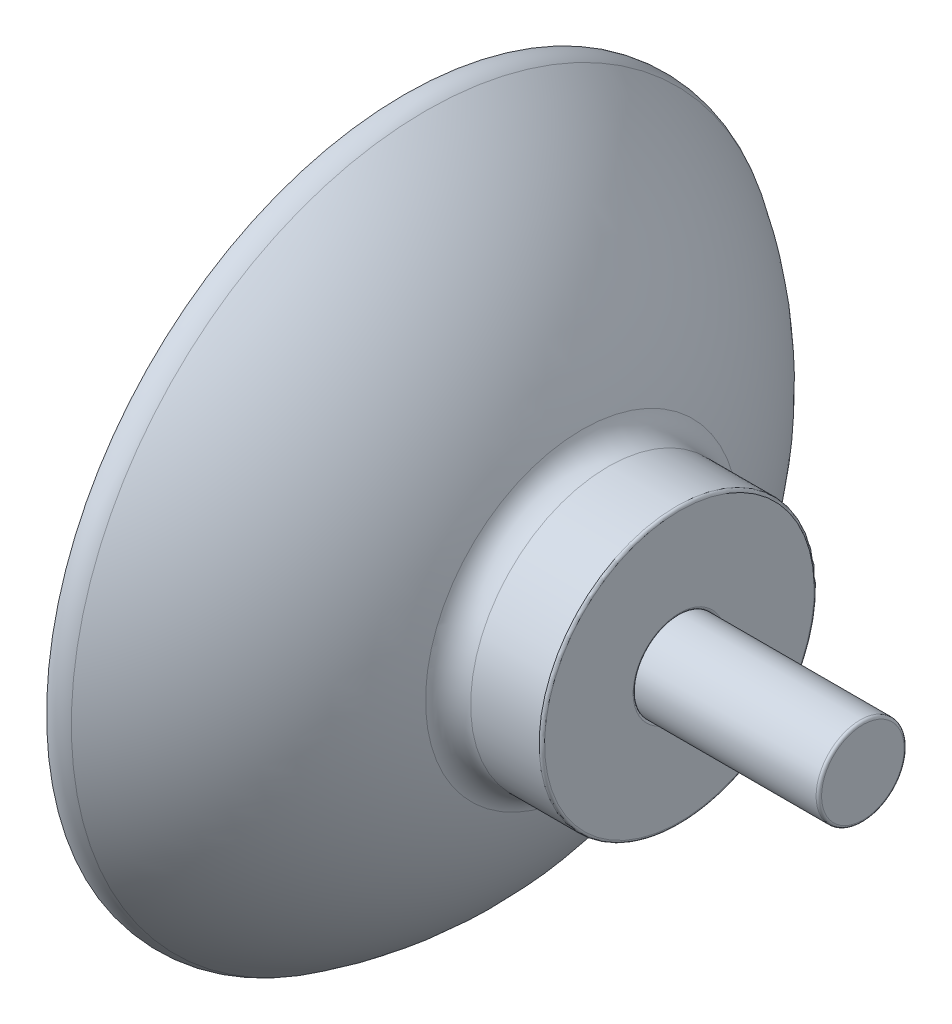
ISO-10303-21;
HEADER;
FILE_DESCRIPTION(('STEP AP214'),'2;1');
FILE_NAME('part.step','',(''),(''),'','','');
FILE_SCHEMA(('AUTOMOTIVE_DESIGN { 1 0 10303 214 1 1 1 1 }'));
ENDSEC;
DATA;
#1=APPLICATION_CONTEXT('core data for automotive mechanical design processes');
#2=APPLICATION_PROTOCOL_DEFINITION('international standard','automotive_design',2000,#1);
#3=PRODUCT_CONTEXT('',#1,'mechanical');
#4=PRODUCT('Part','Part','',(#3));
#5=PRODUCT_RELATED_PRODUCT_CATEGORY('part','',(#4));
#6=PRODUCT_DEFINITION_FORMATION('','',#4);
#7=PRODUCT_DEFINITION_CONTEXT('part definition',#1,'design');
#8=PRODUCT_DEFINITION('design','',#6,#7);
#9=PRODUCT_DEFINITION_SHAPE('','',#8);
#10=(LENGTH_UNIT() NAMED_UNIT(*) SI_UNIT(.MILLI.,.METRE.));
#11=(NAMED_UNIT(*) PLANE_ANGLE_UNIT() SI_UNIT($,.RADIAN.));
#12=(NAMED_UNIT(*) SI_UNIT($,.STERADIAN.) SOLID_ANGLE_UNIT());
#13=UNCERTAINTY_MEASURE_WITH_UNIT(LENGTH_MEASURE(1.E-05),#10,'distance_accuracy_value','');
#14=(GEOMETRIC_REPRESENTATION_CONTEXT(3) GLOBAL_UNCERTAINTY_ASSIGNED_CONTEXT((#13)) GLOBAL_UNIT_ASSIGNED_CONTEXT((#10,
#11,#12)) REPRESENTATION_CONTEXT('',''));
#15=CARTESIAN_POINT('',(0.,0.,0.));
#16=DIRECTION('',(0.,0.,1.));
#17=DIRECTION('',(1.,0.,0.));
#18=AXIS2_PLACEMENT_3D('',#15,#16,#17);
#19=CARTESIAN_POINT('',(2.,0.,0.));
#20=DIRECTION('',(-1.,0.,0.));
#21=DIRECTION('',(0.,0.,1.));
#22=AXIS2_PLACEMENT_3D('',#19,#20,#21);
#23=CYLINDRICAL_SURFACE('',#22,4.75);
#24=CARTESIAN_POINT('',(2.,0.,0.));
#25=DIRECTION('',(-1.,0.,0.));
#26=DIRECTION('',(0.,0.,1.));
#27=AXIS2_PLACEMENT_3D('',#24,#25,#26);
#28=CIRCLE('',#27,4.75);
#29=CARTESIAN_POINT('',(2.,0.,4.75));
#30=VERTEX_POINT('',#29);
#31=EDGE_CURVE('E55',#30,#30,#28,.T.);
#32=ORIENTED_EDGE('',*,*,#31,.F.);
#33=EDGE_LOOP('',(#32));
#34=FACE_BOUND('',#33,.T.);
#35=CARTESIAN_POINT('',(4.,0.,0.));
#36=DIRECTION('',(-1.,0.,0.));
#37=DIRECTION('',(0.,0.,1.));
#38=AXIS2_PLACEMENT_3D('',#35,#36,#37);
#39=CIRCLE('',#38,4.75);
#40=CARTESIAN_POINT('',(4.,0.,4.75));
#41=VERTEX_POINT('',#40);
#42=EDGE_CURVE('E64',#41,#41,#39,.T.);
#43=ORIENTED_EDGE('',*,*,#42,.T.);
#44=EDGE_LOOP('',(#43));
#45=FACE_BOUND('',#44,.T.);
#46=ADVANCED_FACE('F44',(#34,#45),#23,.T.);
#47=CARTESIAN_POINT('',(2.,0.,-4.75));
#48=DIRECTION('',(1.,0.,0.));
#49=DIRECTION('',(0.,0.,-1.));
#50=AXIS2_PLACEMENT_3D('',#47,#48,#49);
#51=PLANE('',#50);
#52=ORIENTED_EDGE('',*,*,#31,.T.);
#53=EDGE_LOOP('',(#52));
#54=FACE_BOUND('',#53,.T.);
#55=ADVANCED_FACE('F82',(#54),#51,.F.);
#56=CARTESIAN_POINT('',(15.,0.,0.));
#57=DIRECTION('',(-1.,0.,0.));
#58=DIRECTION('',(0.,0.,1.));
#59=AXIS2_PLACEMENT_3D('',#56,#57,#58);
#60=PLANE('',#59);
#61=CARTESIAN_POINT('',(15.,0.,0.));
#62=DIRECTION('',(-1.,0.,0.));
#63=DIRECTION('',(0.,0.,1.));
#64=AXIS2_PLACEMENT_3D('',#61,#62,#63);
#65=CIRCLE('',#64,2.25);
#66=CARTESIAN_POINT('',(15.,0.,2.24999999999999));
#67=VERTEX_POINT('',#66);
#68=EDGE_CURVE('E11',#67,#67,#65,.F.);
#69=ORIENTED_EDGE('',*,*,#68,.T.);
#70=EDGE_LOOP('',(#69));
#71=FACE_BOUND('',#70,.T.);
#72=ADVANCED_FACE('F77',(#71),#60,.F.);
#73=CARTESIAN_POINT('',(2.,0.,0.));
#74=DIRECTION('',(-1.,0.,0.));
#75=DIRECTION('',(0.,0.,1.));
#76=AXIS2_PLACEMENT_3D('',#73,#74,#75);
#77=CYLINDRICAL_SURFACE('',#76,2.4);
#78=CARTESIAN_POINT('',(14.85,0.,0.));
#79=DIRECTION('',(-1.,0.,0.));
#80=DIRECTION('',(0.,0.,1.));
#81=AXIS2_PLACEMENT_3D('',#78,#79,#80);
#82=CIRCLE('',#81,2.4);
#83=CARTESIAN_POINT('',(14.85,0.,2.39999999999999));
#84=VERTEX_POINT('',#83);
#85=EDGE_CURVE('E51',#84,#84,#82,.T.);
#86=ORIENTED_EDGE('',*,*,#85,.T.);
#87=EDGE_LOOP('',(#86));
#88=FACE_BOUND('',#87,.T.);
#89=CARTESIAN_POINT('',(4.,0.,0.));
#90=DIRECTION('',(-1.,0.,0.));
#91=DIRECTION('',(0.,0.,1.));
#92=AXIS2_PLACEMENT_3D('',#89,#90,#91);
#93=CIRCLE('',#92,2.4);
#94=CARTESIAN_POINT('',(4.,0.,2.4));
#95=VERTEX_POINT('',#94);
#96=EDGE_CURVE('E59',#95,#95,#93,.T.);
#97=ORIENTED_EDGE('',*,*,#96,.F.);
#98=EDGE_LOOP('',(#97));
#99=FACE_BOUND('',#98,.T.);
#100=ADVANCED_FACE('F72',(#88,#99),#77,.T.);
#101=CARTESIAN_POINT('',(4.,0.,-2.4));
#102=DIRECTION('',(-1.,0.,0.));
#103=DIRECTION('',(0.,0.,1.));
#104=AXIS2_PLACEMENT_3D('',#101,#102,#103);
#105=PLANE('',#104);
#106=ORIENTED_EDGE('',*,*,#42,.F.);
#107=EDGE_LOOP('',(#106));
#108=FACE_BOUND('',#107,.T.);
#109=ORIENTED_EDGE('',*,*,#96,.T.);
#110=EDGE_LOOP('',(#109));
#111=FACE_BOUND('',#110,.T.);
#112=ADVANCED_FACE('F69',(#108,#111),#105,.F.);
#113=CARTESIAN_POINT('',(14.85,0.,0.));
#114=DIRECTION('',(-1.,0.,0.));
#115=DIRECTION('',(0.,0.,1.));
#116=AXIS2_PLACEMENT_3D('',#113,#114,#115);
#117=TOROIDAL_SURFACE('',#116,2.25,0.15);
#118=ORIENTED_EDGE('',*,*,#68,.F.);
#119=EDGE_LOOP('',(#118));
#120=FACE_BOUND('',#119,.T.);
#121=ORIENTED_EDGE('',*,*,#85,.F.);
#122=EDGE_LOOP('',(#121));
#123=FACE_BOUND('',#122,.T.);
#124=ADVANCED_FACE('F46',(#120,#123),#117,.T.);
#125=CLOSED_SHELL('',(#46,#55,#72,#100,#112,#124));
#126=MANIFOLD_SOLID_BREP('B2',#125);
#127=CARTESIAN_POINT('',(-21.7835977429209,0.,0.));
#128=DIRECTION('',(1.,0.,0.));
#129=DIRECTION('',(0.,1.,0.));
#130=AXIS2_PLACEMENT_3D('',#127,#128,#129);
#131=DEGENERATE_TOROIDAL_SURFACE('',#130,0.921872423922007,22.,.T.);
#132=CARTESIAN_POINT('',(0.,0.,0.));
#133=DIRECTION('',(1.,0.,0.));
#134=DIRECTION('',(0.,1.,0.));
#135=AXIS2_PLACEMENT_3D('',#132,#133,#134);
#136=CIRCLE('',#135,3.99999999999999);
#137=CARTESIAN_POINT('',(0.,3.99999999999999,0.));
#138=VERTEX_POINT('',#137);
#139=EDGE_CURVE('E163',#138,#138,#136,.T.);
#140=ORIENTED_EDGE('',*,*,#139,.T.);
#141=EDGE_LOOP('',(#140));
#142=FACE_BOUND('',#141,.T.);
#143=CARTESIAN_POINT('',(-10.,0.,0.));
#144=DIRECTION('',(1.,0.,0.));
#145=DIRECTION('',(0.,1.,0.));
#146=AXIS2_PLACEMENT_3D('',#143,#144,#145);
#147=CIRCLE('',#146,19.5);
#148=CARTESIAN_POINT('',(-10.,19.5,0.));
#149=VERTEX_POINT('',#148);
#150=EDGE_CURVE('E160',#149,#149,#147,.T.);
#151=ORIENTED_EDGE('',*,*,#150,.F.);
#152=EDGE_LOOP('',(#151));
#153=FACE_BOUND('',#152,.T.);
#154=ADVANCED_FACE('F131',(#142,#153),#131,.F.);
#155=CARTESIAN_POINT('',(0.,0.,0.));
#156=DIRECTION('',(1.,0.,0.));
#157=DIRECTION('',(0.,1.,0.));
#158=AXIS2_PLACEMENT_3D('',#155,#156,#157);
#159=PLANE('',#158);
#160=ORIENTED_EDGE('',*,*,#139,.F.);
#161=EDGE_LOOP('',(#160));
#162=FACE_BOUND('',#161,.T.);
#163=ADVANCED_FACE('F194',(#162),#159,.F.);
#164=CARTESIAN_POINT('',(2.,0.,0.));
#165=DIRECTION('',(1.,0.,0.));
#166=DIRECTION('',(0.,1.,0.));
#167=AXIS2_PLACEMENT_3D('',#164,#165,#166);
#168=PLANE('',#167);
#169=CARTESIAN_POINT('',(2.,0.,0.));
#170=DIRECTION('',(1.,0.,0.));
#171=DIRECTION('',(0.,1.,0.));
#172=AXIS2_PLACEMENT_3D('',#169,#170,#171);
#173=CIRCLE('',#172,4.75);
#174=CARTESIAN_POINT('',(2.,4.75,0.));
#175=VERTEX_POINT('',#174);
#176=EDGE_CURVE('E166',#175,#175,#173,.T.);
#177=ORIENTED_EDGE('',*,*,#176,.T.);
#178=EDGE_LOOP('',(#177));
#179=FACE_BOUND('',#178,.T.);
#180=ADVANCED_FACE('F200',(#179),#168,.T.);
#181=CARTESIAN_POINT('',(0.,0.,0.));
#182=DIRECTION('',(1.,0.,0.));
#183=DIRECTION('',(0.,1.,0.));
#184=AXIS2_PLACEMENT_3D('',#181,#182,#183);
#185=CYLINDRICAL_SURFACE('',#184,4.75);
#186=CARTESIAN_POINT('',(4.,0.,0.));
#187=DIRECTION('',(1.,0.,0.));
#188=DIRECTION('',(0.,1.,0.));
#189=AXIS2_PLACEMENT_3D('',#186,#187,#188);
#190=CIRCLE('',#189,4.75);
#191=CARTESIAN_POINT('',(4.,4.75,0.));
#192=VERTEX_POINT('',#191);
#193=EDGE_CURVE('E169',#192,#192,#190,.T.);
#194=ORIENTED_EDGE('',*,*,#193,.T.);
#195=EDGE_LOOP('',(#194));
#196=FACE_BOUND('',#195,.T.);
#197=ORIENTED_EDGE('',*,*,#176,.F.);
#198=EDGE_LOOP('',(#197));
#199=FACE_BOUND('',#198,.T.);
#200=ADVANCED_FACE('F190',(#196,#199),#185,.F.);
#201=CARTESIAN_POINT('',(4.,0.,0.));
#202=DIRECTION('',(1.,0.,0.));
#203=DIRECTION('',(0.,1.,0.));
#204=AXIS2_PLACEMENT_3D('',#201,#202,#203);
#205=PLANE('',#204);
#206=ORIENTED_EDGE('',*,*,#193,.F.);
#207=EDGE_LOOP('',(#206));
#208=FACE_BOUND('',#207,.T.);
#209=CARTESIAN_POINT('',(4.,0.,0.));
#210=DIRECTION('',(1.,0.,0.));
#211=DIRECTION('',(0.,1.,0.));
#212=AXIS2_PLACEMENT_3D('',#209,#210,#211);
#213=CIRCLE('',#212,2.375);
#214=CARTESIAN_POINT('',(4.,2.375,0.));
#215=VERTEX_POINT('',#214);
#216=EDGE_CURVE('E172',#215,#215,#213,.T.);
#217=ORIENTED_EDGE('',*,*,#216,.T.);
#218=EDGE_LOOP('',(#217));
#219=FACE_BOUND('',#218,.T.);
#220=ADVANCED_FACE('F176',(#208,#219),#205,.F.);
#221=CARTESIAN_POINT('',(0.,0.,0.));
#222=DIRECTION('',(1.,0.,0.));
#223=DIRECTION('',(0.,1.,0.));
#224=AXIS2_PLACEMENT_3D('',#221,#222,#223);
#225=CYLINDRICAL_SURFACE('',#224,2.375);
#226=CARTESIAN_POINT('',(4.85,0.,0.));
#227=DIRECTION('',(1.,0.,0.));
#228=DIRECTION('',(0.,1.,0.));
#229=AXIS2_PLACEMENT_3D('',#226,#227,#228);
#230=CIRCLE('',#229,2.375);
#231=CARTESIAN_POINT('',(4.85,2.375,0.));
#232=VERTEX_POINT('',#231);
#233=EDGE_CURVE('E151',#232,#232,#230,.T.);
#234=ORIENTED_EDGE('',*,*,#233,.T.);
#235=EDGE_LOOP('',(#234));
#236=FACE_BOUND('',#235,.T.);
#237=ORIENTED_EDGE('',*,*,#216,.F.);
#238=EDGE_LOOP('',(#237));
#239=FACE_BOUND('',#238,.T.);
#240=ADVANCED_FACE('F178',(#236,#239),#225,.F.);
#241=CARTESIAN_POINT('',(5.,0.,0.));
#242=DIRECTION('',(1.,0.,0.));
#243=DIRECTION('',(0.,1.,0.));
#244=AXIS2_PLACEMENT_3D('',#241,#242,#243);
#245=PLANE('',#244);
#246=CARTESIAN_POINT('',(5.,0.,0.));
#247=DIRECTION('',(1.,0.,0.));
#248=DIRECTION('',(0.,1.,0.));
#249=AXIS2_PLACEMENT_3D('',#246,#247,#248);
#250=CIRCLE('',#249,2.525);
#251=CARTESIAN_POINT('',(5.,2.525,0.));
#252=VERTEX_POINT('',#251);
#253=EDGE_CURVE('E146',#252,#252,#250,.F.);
#254=ORIENTED_EDGE('',*,*,#253,.T.);
#255=EDGE_LOOP('',(#254));
#256=FACE_BOUND('',#255,.T.);
#257=CARTESIAN_POINT('',(5.,0.,0.));
#258=DIRECTION('',(1.,0.,0.));
#259=DIRECTION('',(0.,1.,0.));
#260=AXIS2_PLACEMENT_3D('',#257,#258,#259);
#261=CIRCLE('',#260,7.35);
#262=CARTESIAN_POINT('',(5.,7.35,0.));
#263=VERTEX_POINT('',#262);
#264=EDGE_CURVE('E157',#263,#263,#261,.T.);
#265=ORIENTED_EDGE('',*,*,#264,.T.);
#266=EDGE_LOOP('',(#265));
#267=FACE_BOUND('',#266,.T.);
#268=ADVANCED_FACE('F180',(#256,#267),#245,.T.);
#269=CARTESIAN_POINT('',(0.,0.,0.));
#270=DIRECTION('',(1.,0.,0.));
#271=DIRECTION('',(0.,1.,0.));
#272=AXIS2_PLACEMENT_3D('',#269,#270,#271);
#273=CYLINDRICAL_SURFACE('',#272,7.5);
#274=CARTESIAN_POINT('',(1.11723092580122,0.,0.));
#275=DIRECTION('',(1.,0.,0.));
#276=DIRECTION('',(0.,1.,0.));
#277=AXIS2_PLACEMENT_3D('',#274,#275,#276);
#278=CIRCLE('',#277,7.5);
#279=CARTESIAN_POINT('',(1.11723092580122,7.5,0.));
#280=VERTEX_POINT('',#279);
#281=EDGE_CURVE('E43',#280,#280,#278,.T.);
#282=ORIENTED_EDGE('',*,*,#281,.T.);
#283=EDGE_LOOP('',(#282));
#284=FACE_BOUND('',#283,.T.);
#285=CARTESIAN_POINT('',(4.85,0.,0.));
#286=DIRECTION('',(1.,0.,0.));
#287=DIRECTION('',(0.,1.,0.));
#288=AXIS2_PLACEMENT_3D('',#285,#286,#287);
#289=CIRCLE('',#288,7.5);
#290=CARTESIAN_POINT('',(4.85,7.5,0.));
#291=VERTEX_POINT('',#290);
#292=EDGE_CURVE('E154',#291,#291,#289,.F.);
#293=ORIENTED_EDGE('',*,*,#292,.T.);
#294=EDGE_LOOP('',(#293));
#295=FACE_BOUND('',#294,.T.);
#296=ADVANCED_FACE('F187',(#284,#295),#273,.T.);
#297=CARTESIAN_POINT('',(-19.3122304000596,0.,0.));
#298=DIRECTION('',(1.,0.,0.));
#299=DIRECTION('',(0.,1.,0.));
#300=AXIS2_PLACEMENT_3D('',#297,#298,#299);
#301=DEGENERATE_TOROIDAL_SURFACE('',#300,2.30021567995232,20.,.T.);
#302=CARTESIAN_POINT('',(-8.82290536756028,0.,0.));
#303=DIRECTION('',(-1.,0.,0.));
#304=DIRECTION('',(0.,-1.,0.));
#305=AXIS2_PLACEMENT_3D('',#302,#303,#304);
#306=CIRCLE('',#305,19.328840414868);
#307=CARTESIAN_POINT('',(-8.82290536756028,-19.328840414868,0.));
#308=VERTEX_POINT('',#307);
#309=EDGE_CURVE('E138',#308,#308,#306,.F.);
#310=ORIENTED_EDGE('',*,*,#309,.T.);
#311=EDGE_LOOP('',(#310));
#312=FACE_BOUND('',#311,.T.);
#313=CARTESIAN_POINT('',(-0.308080329491395,0.,0.));
#314=DIRECTION('',(-1.,0.,0.));
#315=DIRECTION('',(0.,-1.,0.));
#316=AXIS2_PLACEMENT_3D('',#313,#314,#315);
#317=CIRCLE('',#316,8.53257318697342);
#318=CARTESIAN_POINT('',(-0.308080329491394,-8.53257318697342,0.));
#319=VERTEX_POINT('',#318);
#320=EDGE_CURVE('E142',#319,#319,#317,.T.);
#321=ORIENTED_EDGE('',*,*,#320,.T.);
#322=EDGE_LOOP('',(#321));
#323=FACE_BOUND('',#322,.T.);
#324=ADVANCED_FACE('F210',(#312,#323),#301,.T.);
#325=CARTESIAN_POINT('',(4.85,0.,0.));
#326=DIRECTION('',(1.,0.,0.));
#327=DIRECTION('',(0.,1.,0.));
#328=AXIS2_PLACEMENT_3D('',#325,#326,#327);
#329=TOROIDAL_SURFACE('',#328,7.35,0.15);
#330=ORIENTED_EDGE('',*,*,#292,.F.);
#331=EDGE_LOOP('',(#330));
#332=FACE_BOUND('',#331,.T.);
#333=ORIENTED_EDGE('',*,*,#264,.F.);
#334=EDGE_LOOP('',(#333));
#335=FACE_BOUND('',#334,.T.);
#336=ADVANCED_FACE('F206',(#332,#335),#329,.T.);
#337=CARTESIAN_POINT('',(4.85,0.,0.));
#338=DIRECTION('',(1.,0.,0.));
#339=DIRECTION('',(0.,1.,0.));
#340=AXIS2_PLACEMENT_3D('',#337,#338,#339);
#341=TOROIDAL_SURFACE('',#340,2.525,0.15);
#342=ORIENTED_EDGE('',*,*,#253,.F.);
#343=EDGE_LOOP('',(#342));
#344=FACE_BOUND('',#343,.T.);
#345=ORIENTED_EDGE('',*,*,#233,.F.);
#346=EDGE_LOOP('',(#345));
#347=FACE_BOUND('',#346,.T.);
#348=ADVANCED_FACE('F209',(#344,#347),#341,.T.);
#349=CARTESIAN_POINT('',(-9.60960474499774,0.,0.));
#350=DIRECTION('',(-1.,0.,0.));
#351=DIRECTION('',(0.,-1.,0.));
#352=AXIS2_PLACEMENT_3D('',#349,#350,#351);
#353=TOROIDAL_SURFACE('',#352,18.0516935597493,1.5);
#354=ORIENTED_EDGE('',*,*,#150,.T.);
#355=EDGE_LOOP('',(#354));
#356=FACE_BOUND('',#355,.T.);
#357=ORIENTED_EDGE('',*,*,#309,.F.);
#358=EDGE_LOOP('',(#357));
#359=FACE_BOUND('',#358,.T.);
#360=ADVANCED_FACE('F213',(#356,#359),#353,.T.);
#361=CARTESIAN_POINT('',(1.11723092580122,0.,0.));
#362=DIRECTION('',(1.,0.,0.));
#363=DIRECTION('',(0.,1.,0.));
#364=AXIS2_PLACEMENT_3D('',#361,#362,#363);
#365=TOROIDAL_SURFACE('',#364,9.,1.5);
#366=ORIENTED_EDGE('',*,*,#320,.F.);
#367=EDGE_LOOP('',(#366));
#368=FACE_BOUND('',#367,.T.);
#369=ORIENTED_EDGE('',*,*,#281,.F.);
#370=EDGE_LOOP('',(#369));
#371=FACE_BOUND('',#370,.T.);
#372=ADVANCED_FACE('F133',(#368,#371),#365,.F.);
#373=CLOSED_SHELL('',(#154,#163,#180,#200,#220,#240,#268,#296,#324,#336,#348,#360,#372));
#374=MANIFOLD_SOLID_BREP('B6',#373);
#375=ADVANCED_BREP_SHAPE_REPRESENTATION('',(#18,#126,#374),#14);
#376=SHAPE_DEFINITION_REPRESENTATION(#9,#375);
ENDSEC;
END-ISO-10303-21;
